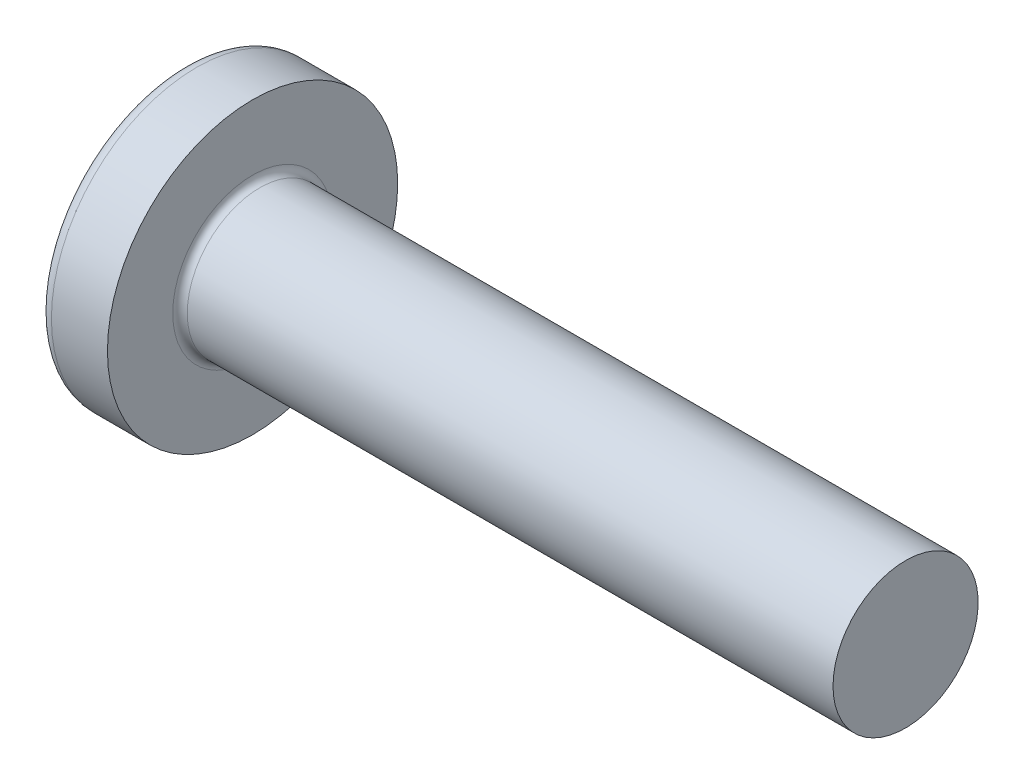
ISO-10303-21;
HEADER;
FILE_DESCRIPTION(('STEP AP214'),'2;1');
FILE_NAME('part.step','',(''),(''),'','','');
FILE_SCHEMA(('AUTOMOTIVE_DESIGN { 1 0 10303 214 1 1 1 1 }'));
ENDSEC;
DATA;
#1=APPLICATION_CONTEXT('core data for automotive mechanical design processes');
#2=APPLICATION_PROTOCOL_DEFINITION('international standard','automotive_design',2000,#1);
#3=PRODUCT_CONTEXT('',#1,'mechanical');
#4=PRODUCT('Part','Part','',(#3));
#5=PRODUCT_RELATED_PRODUCT_CATEGORY('part','',(#4));
#6=PRODUCT_DEFINITION_FORMATION('','',#4);
#7=PRODUCT_DEFINITION_CONTEXT('part definition',#1,'design');
#8=PRODUCT_DEFINITION('design','',#6,#7);
#9=PRODUCT_DEFINITION_SHAPE('','',#8);
#10=(LENGTH_UNIT() NAMED_UNIT(*) SI_UNIT(.MILLI.,.METRE.));
#11=(NAMED_UNIT(*) PLANE_ANGLE_UNIT() SI_UNIT($,.RADIAN.));
#12=(NAMED_UNIT(*) SI_UNIT($,.STERADIAN.) SOLID_ANGLE_UNIT());
#13=UNCERTAINTY_MEASURE_WITH_UNIT(LENGTH_MEASURE(1.E-05),#10,'distance_accuracy_value','');
#14=(GEOMETRIC_REPRESENTATION_CONTEXT(3) GLOBAL_UNCERTAINTY_ASSIGNED_CONTEXT((#13)) GLOBAL_UNIT_ASSIGNED_CONTEXT((#10,
#11,#12)) REPRESENTATION_CONTEXT('',''));
#15=CARTESIAN_POINT('',(0.,0.,0.));
#16=DIRECTION('',(0.,0.,1.));
#17=DIRECTION('',(1.,0.,0.));
#18=AXIS2_PLACEMENT_3D('',#15,#16,#17);
#19=CARTESIAN_POINT('',(6.5,0.,0.));
#20=DIRECTION('',(-1.,0.,0.));
#21=DIRECTION('',(0.,1.,0.));
#22=AXIS2_PLACEMENT_3D('',#19,#20,#21);
#23=SPHERICAL_SURFACE('',#22,6.5);
#24=CARTESIAN_POINT('',(1.26538895452803,0.,0.));
#25=DIRECTION('',(-1.,0.,0.));
#26=DIRECTION('',(0.,0.,1.));
#27=AXIS2_PLACEMENT_3D('',#24,#25,#26);
#28=CIRCLE('',#27,3.85342019543974);
#29=CARTESIAN_POINT('',(1.26538895452803,0.,3.85342019543974));
#30=VERTEX_POINT('',#29);
#31=EDGE_CURVE('E212',#30,#30,#28,.T.);
#32=ORIENTED_EDGE('',*,*,#31,.T.);
#33=EDGE_LOOP('',(#32));
#34=FACE_BOUND('',#33,.T.);
#35=CARTESIAN_POINT('',(0.0788099820016241,0.,0.));
#36=DIRECTION('',(1.,0.,0.));
#37=DIRECTION('',(0.,0.,-1.));
#38=AXIS2_PLACEMENT_3D('',#35,#36,#37);
#39=CIRCLE('',#38,1.0091178091571);
#40=CARTESIAN_POINT('',(0.0788099820016244,-0.514999999999996,-0.867809744562728));
#41=VERTEX_POINT('',#40);
#42=CARTESIAN_POINT('',(0.0788099820016241,-0.867809744562729,-0.515));
#43=VERTEX_POINT('',#42);
#44=EDGE_CURVE('E338',#41,#43,#39,.F.);
#45=ORIENTED_EDGE('',*,*,#44,.F.);
#46=CARTESIAN_POINT('',(6.5,-0.515000000000001,0.));
#47=DIRECTION('',(0.,1.,0.));
#48=DIRECTION('',(0.,0.,1.));
#49=AXIS2_PLACEMENT_3D('',#46,#47,#48);
#50=CIRCLE('',#49,6.47956595768575);
#51=CARTESIAN_POINT('',(0.331830520157854,-0.514999999999992,-1.98455543332603));
#52=VERTEX_POINT('',#51);
#53=EDGE_CURVE('E272',#52,#41,#50,.T.);
#54=ORIENTED_EDGE('',*,*,#53,.F.);
#55=CARTESIAN_POINT('',(6.06443225879603,0.,0.873613881878153));
#56=DIRECTION('',(0.446197753347436,0.,-0.894934391398443));
#57=DIRECTION('',(-0.894934391398442,0.,-0.446197753347436));
#58=AXIS2_PLACEMENT_3D('',#55,#56,#57);
#59=CIRCLE('',#58,6.42628038045433);
#60=CARTESIAN_POINT('',(0.331830520157856,0.515000000000007,-1.98455543332603));
#61=VERTEX_POINT('',#60);
#62=EDGE_CURVE('E246',#52,#61,#59,.T.);
#63=ORIENTED_EDGE('',*,*,#62,.T.);
#64=CARTESIAN_POINT('',(6.5,0.515,0.));
#65=DIRECTION('',(0.,-1.,0.));
#66=DIRECTION('',(0.,0.,-1.));
#67=AXIS2_PLACEMENT_3D('',#64,#65,#66);
#68=CIRCLE('',#67,6.47956595768574);
#69=CARTESIAN_POINT('',(0.0788099820016249,0.515000000000003,-0.867809744562724));
#70=VERTEX_POINT('',#69);
#71=EDGE_CURVE('E300',#70,#61,#68,.T.);
#72=ORIENTED_EDGE('',*,*,#71,.F.);
#73=CARTESIAN_POINT('',(0.0788099820016241,0.867809744562719,-0.515));
#74=VERTEX_POINT('',#73);
#75=EDGE_CURVE('E353',#74,#70,#39,.F.);
#76=ORIENTED_EDGE('',*,*,#75,.F.);
#77=CARTESIAN_POINT('',(6.5,0.,-0.515));
#78=DIRECTION('',(0.,0.,1.));
#79=DIRECTION('',(1.,0.,0.));
#80=AXIS2_PLACEMENT_3D('',#77,#78,#79);
#81=CIRCLE('',#80,6.47956595768574);
#82=CARTESIAN_POINT('',(0.331830520157856,1.98455543332603,-0.515));
#83=VERTEX_POINT('',#82);
#84=EDGE_CURVE('E240',#83,#74,#81,.T.);
#85=ORIENTED_EDGE('',*,*,#84,.F.);
#86=CARTESIAN_POINT('',(6.06443225879604,-0.873613881878154,0.));
#87=DIRECTION('',(0.446197753347436,0.894934391398443,0.));
#88=DIRECTION('',(-0.894934391398442,0.446197753347436,0.));
#89=AXIS2_PLACEMENT_3D('',#86,#87,#88);
#90=CIRCLE('',#89,6.42628038045433);
#91=CARTESIAN_POINT('',(0.331830520157857,1.98455543332603,0.515));
#92=VERTEX_POINT('',#91);
#93=EDGE_CURVE('E243',#83,#92,#90,.T.);
#94=ORIENTED_EDGE('',*,*,#93,.T.);
#95=CARTESIAN_POINT('',(6.5,0.,0.515000000000001));
#96=DIRECTION('',(0.,0.,-1.));
#97=DIRECTION('',(-1.,0.,0.));
#98=AXIS2_PLACEMENT_3D('',#95,#96,#97);
#99=CIRCLE('',#98,6.47956595768574);
#100=CARTESIAN_POINT('',(0.0788099820016241,0.867809744562719,0.514999999999999));
#101=VERTEX_POINT('',#100);
#102=EDGE_CURVE('E236',#101,#92,#99,.T.);
#103=ORIENTED_EDGE('',*,*,#102,.F.);
#104=CARTESIAN_POINT('',(0.0788099820016253,0.514999999999997,0.867809744562727));
#105=VERTEX_POINT('',#104);
#106=EDGE_CURVE('E352',#105,#101,#39,.F.);
#107=ORIENTED_EDGE('',*,*,#106,.F.);
#108=CARTESIAN_POINT('',(0.331830520157856,0.514999999999993,1.98455543332603));
#109=VERTEX_POINT('',#108);
#110=EDGE_CURVE('E256',#109,#105,#68,.T.);
#111=ORIENTED_EDGE('',*,*,#110,.F.);
#112=CARTESIAN_POINT('',(6.06443225879603,0.,-0.873613881878153));
#113=DIRECTION('',(0.446197753347436,0.,0.894934391398443));
#114=DIRECTION('',(0.894934391398442,0.,-0.446197753347436));
#115=AXIS2_PLACEMENT_3D('',#112,#113,#114);
#116=CIRCLE('',#115,6.42628038045433);
#117=CARTESIAN_POINT('',(0.331830520157855,-0.515000000000007,1.98455543332603));
#118=VERTEX_POINT('',#117);
#119=EDGE_CURVE('E47',#109,#118,#116,.T.);
#120=ORIENTED_EDGE('',*,*,#119,.T.);
#121=CARTESIAN_POINT('',(0.0788099820016247,-0.515000000000003,0.867809744562724));
#122=VERTEX_POINT('',#121);
#123=EDGE_CURVE('E253',#122,#118,#50,.T.);
#124=ORIENTED_EDGE('',*,*,#123,.F.);
#125=CARTESIAN_POINT('',(0.0788099820016241,-0.867809744562729,0.514999999999999));
#126=VERTEX_POINT('',#125);
#127=EDGE_CURVE('E384',#126,#122,#39,.F.);
#128=ORIENTED_EDGE('',*,*,#127,.F.);
#129=CARTESIAN_POINT('',(0.331830520157853,-1.98455543332603,0.514999999999999));
#130=VERTEX_POINT('',#129);
#131=EDGE_CURVE('E237',#130,#126,#99,.T.);
#132=ORIENTED_EDGE('',*,*,#131,.F.);
#133=CARTESIAN_POINT('',(6.06443225879603,0.873613881878152,0.));
#134=DIRECTION('',(0.446197753347436,-0.894934391398443,0.));
#135=DIRECTION('',(0.894934391398442,0.446197753347436,0.));
#136=AXIS2_PLACEMENT_3D('',#133,#134,#135);
#137=CIRCLE('',#136,6.42628038045433);
#138=CARTESIAN_POINT('',(0.331830520157853,-1.98455543332603,-0.515));
#139=VERTEX_POINT('',#138);
#140=EDGE_CURVE('E233',#130,#139,#137,.T.);
#141=ORIENTED_EDGE('',*,*,#140,.T.);
#142=EDGE_CURVE('E62',#43,#139,#81,.T.);
#143=ORIENTED_EDGE('',*,*,#142,.F.);
#144=EDGE_LOOP('',(#45,#54,#63,#72,#76,#85,#94,#103,#107,#111,#120,#124,#128,#132,#141,#143));
#145=FACE_BOUND('',#144,.T.);
#146=ADVANCED_FACE('F34',(#34,#145),#23,.T.);
#147=CARTESIAN_POINT('',(0.,2.15,-0.515));
#148=DIRECTION('',(0.,0.,1.));
#149=DIRECTION('',(1.,0.,0.));
#150=AXIS2_PLACEMENT_3D('',#147,#148,#149);
#151=PLANE('',#150);
#152=ORIENTED_EDGE('',*,*,#84,.T.);
#153=CARTESIAN_POINT('',(-1.51195208675156,0.994972220320188,-0.515));
#154=CARTESIAN_POINT('',(-1.20405981949279,0.970722016949958,-0.515));
#155=CARTESIAN_POINT('',(-0.896180907521174,0.946299109919651,-0.515));
#156=CARTESIAN_POINT('',(-0.280449079832185,0.896981122427851,-0.515));
#157=CARTESIAN_POINT('',(0.0274038344396873,0.872086023934883,-0.515));
#158=CARTESIAN_POINT('',(0.489146739515351,0.83429553519528,-0.515));
#159=CARTESIAN_POINT('',(0.643055047553846,0.821624058404092,-0.515));
#160=CARTESIAN_POINT('',(0.950856520197141,0.796108332639504,-0.515));
#161=CARTESIAN_POINT('',(1.10474968487868,0.783264084592465,-0.515));
#162=CARTESIAN_POINT('',(1.41251352095103,0.757376569093378,-0.515));
#163=CARTESIAN_POINT('',(1.56638419296577,0.744333309065218,-0.515));
#164=CARTESIAN_POINT('',(1.87410847343335,0.718013273188896,-0.515));
#165=CARTESIAN_POINT('',(2.02796208151372,0.704736492982792,-0.515));
#166=CARTESIAN_POINT('',(2.36455311890989,0.675386943006726,-0.515));
#167=CARTESIAN_POINT('',(2.54728562293342,0.659257575640986,-0.515));
#168=CARTESIAN_POINT('',(2.91270624109256,0.626517182479888,-0.515));
#169=CARTESIAN_POINT('',(3.09539435554038,0.609906160177238,-0.515));
#170=CARTESIAN_POINT('',(3.46069832191612,0.576073027116421,-0.515));
#171=CARTESIAN_POINT('',(3.64331417870068,0.558850968932727,-0.515));
#172=CARTESIAN_POINT('',(4.00847437496567,0.523604864540037,-0.515));
#173=CARTESIAN_POINT('',(4.19101871216888,0.505580794604253,-0.515));
#174=CARTESIAN_POINT('',(4.55606208157937,0.468429191666488,-0.515));
#175=CARTESIAN_POINT('',(4.73856107358022,0.449301262281854,-0.515));
#176=CARTESIAN_POINT('',(5.10337547353418,0.409473604748924,-0.515));
#177=CARTESIAN_POINT('',(5.28569089526422,0.388774005106069,-0.515));
#178=CARTESIAN_POINT('',(5.55897278495412,0.355828287527264,-0.515));
#179=CARTESIAN_POINT('',(5.65005277419686,0.344527918782738,-0.515));
#180=CARTESIAN_POINT('',(5.83209904103607,0.321075174263031,-0.515));
#181=CARTESIAN_POINT('',(5.92306532397915,0.308922840209686,-0.515));
#182=CARTESIAN_POINT('',(6.10486078872898,0.28342733445193,-0.515));
#183=CARTESIAN_POINT('',(6.19568992299379,0.270083817601714,-0.515));
#184=CARTESIAN_POINT('',(6.33172773785679,0.248701420809951,-0.515));
#185=CARTESIAN_POINT('',(6.37704304473344,0.241345446705304,-0.515));
#186=CARTESIAN_POINT('',(6.4675722520141,0.226018953559337,-0.515));
#187=CARTESIAN_POINT('',(6.51278614568083,0.218048394864476,-0.515));
#188=CARTESIAN_POINT('',(6.55793125759548,0.209691465274944,-0.515));
#189=B_SPLINE_CURVE_WITH_KNOTS('',3,(#153,#154,#155,#156,#157,#158,#159,#160,#161,#162,#163,
#164,#165,#166,#167,#168,#169,#170,#171,#172,#173,#174,#175,#176,#177,#178,#179,#180,#181,#182,
#183,#184,#185,#186,#187,#188),.UNSPECIFIED.,.F.,.F.,(4,2,2,2,2,2,2,2,2,2,2,2,2,2,2,2,2,4),(0.,
0.926537709781721,1.85311087258339,2.31639796016285,2.77968256468771,3.24294992902055,
3.70622594801777,4.25655436065378,4.80687878359543,5.35715597005738,5.90744944680718,
6.45794177197673,7.008389135274,7.28372117336898,7.55903973750591,7.83443833587748,
7.97216007460854,8.10989070671571),.UNSPECIFIED.);
#190=CARTESIAN_POINT('',(2.34,0.677477674908923,-0.515));
#191=VERTEX_POINT('',#190);
#192=EDGE_CURVE('E373',#74,#191,#189,.T.);
#193=ORIENTED_EDGE('',*,*,#192,.T.);
#194=DIRECTION('',(0.,1.,0.));
#195=VECTOR('',#194,1.);
#196=CARTESIAN_POINT('',(2.34,-0.983319232260742,-0.515));
#197=LINE('',#196,#195);
#198=CARTESIAN_POINT('',(2.34,0.983319232260743,-0.515));
#199=VERTEX_POINT('',#198);
#200=EDGE_CURVE('E321',#191,#199,#197,.T.);
#201=ORIENTED_EDGE('',*,*,#200,.T.);
#202=DIRECTION('',(0.894934391398442,-0.446197753347436,0.));
#203=VECTOR('',#202,1.);
#204=CARTESIAN_POINT('',(0.,2.15,-0.515));
#205=LINE('',#204,#203);
#206=EDGE_CURVE('E213',#83,#199,#205,.T.);
#207=ORIENTED_EDGE('',*,*,#206,.F.);
#208=EDGE_LOOP('',(#152,#193,#201,#207));
#209=FACE_BOUND('',#208,.T.);
#210=ADVANCED_FACE('F168',(#209),#151,.T.);
#211=CARTESIAN_POINT('',(2.34,-0.983319232260742,-0.515));
#212=VERTEX_POINT('',#211);
#213=CARTESIAN_POINT('',(2.34,-0.677477674908923,-0.515));
#214=VERTEX_POINT('',#213);
#215=EDGE_CURVE('E221',#212,#214,#197,.T.);
#216=ORIENTED_EDGE('',*,*,#215,.T.);
#217=CARTESIAN_POINT('',(-1.51195208675156,-0.994972220320188,-0.515));
#218=CARTESIAN_POINT('',(-1.20405981949279,-0.970722016949958,-0.515));
#219=CARTESIAN_POINT('',(-0.896180907521174,-0.946299109919651,-0.515));
#220=CARTESIAN_POINT('',(-0.280449079832185,-0.896981122427851,-0.515));
#221=CARTESIAN_POINT('',(0.027403834439687,-0.872086023934883,-0.515));
#222=CARTESIAN_POINT('',(0.48914673951535,-0.83429553519528,-0.515));
#223=CARTESIAN_POINT('',(0.643055047553845,-0.821624058404092,-0.515));
#224=CARTESIAN_POINT('',(0.95085652019714,-0.796108332639504,-0.515));
#225=CARTESIAN_POINT('',(1.10474968487868,-0.783264084592466,-0.515));
#226=CARTESIAN_POINT('',(1.41251352095103,-0.757376569093378,-0.515));
#227=CARTESIAN_POINT('',(1.56638419296577,-0.744333309065218,-0.515));
#228=CARTESIAN_POINT('',(1.87410847343335,-0.718013273188896,-0.515));
#229=CARTESIAN_POINT('',(2.02796208151372,-0.704736492982792,-0.515));
#230=CARTESIAN_POINT('',(2.36455311890989,-0.675386943006726,-0.515));
#231=CARTESIAN_POINT('',(2.54728562293342,-0.659257575640986,-0.515));
#232=CARTESIAN_POINT('',(2.91270624109256,-0.626517182479888,-0.515));
#233=CARTESIAN_POINT('',(3.09539435554038,-0.609906160177238,-0.515));
#234=CARTESIAN_POINT('',(3.46069832191613,-0.576073027116421,-0.515));
#235=CARTESIAN_POINT('',(3.64331417870068,-0.558850968932727,-0.515));
#236=CARTESIAN_POINT('',(4.00847437496567,-0.523604864540037,-0.515));
#237=CARTESIAN_POINT('',(4.19101871216888,-0.505580794604252,-0.515));
#238=CARTESIAN_POINT('',(4.55606208157937,-0.468429191666487,-0.515));
#239=CARTESIAN_POINT('',(4.73856107358023,-0.449301262281853,-0.515));
#240=CARTESIAN_POINT('',(5.10337547353419,-0.409473604748924,-0.515));
#241=CARTESIAN_POINT('',(5.28569089526422,-0.388774005106069,-0.515));
#242=CARTESIAN_POINT('',(5.55897278495412,-0.355828287527264,-0.515));
#243=CARTESIAN_POINT('',(5.65005277419686,-0.344527918782738,-0.515));
#244=CARTESIAN_POINT('',(5.83209904103608,-0.32107517426303,-0.515));
#245=CARTESIAN_POINT('',(5.92306532397915,-0.308922840209685,-0.515));
#246=CARTESIAN_POINT('',(6.10486078872898,-0.283427334451929,-0.515));
#247=CARTESIAN_POINT('',(6.1956899229938,-0.270083817601713,-0.515));
#248=CARTESIAN_POINT('',(6.33172773785679,-0.24870142080995,-0.515));
#249=CARTESIAN_POINT('',(6.37704304473344,-0.241345446705303,-0.515));
#250=CARTESIAN_POINT('',(6.4675722520141,-0.226018953559337,-0.515));
#251=CARTESIAN_POINT('',(6.51278614568083,-0.218048394864475,-0.515));
#252=CARTESIAN_POINT('',(6.55793125759549,-0.209691465274944,-0.515));
#253=B_SPLINE_CURVE_WITH_KNOTS('',3,(#217,#218,#219,#220,#221,#222,#223,#224,#225,#226,#227,
#228,#229,#230,#231,#232,#233,#234,#235,#236,#237,#238,#239,#240,#241,#242,#243,#244,#245,#246,
#247,#248,#249,#250,#251,#252),.UNSPECIFIED.,.F.,.F.,(4,2,2,2,2,2,2,2,2,2,2,2,2,2,2,2,2,4),(0.,
0.926537709781721,1.85311087258339,2.31639796016285,2.77968256468771,3.24294992902054,
3.70622594801777,4.25655436065378,4.80687878359543,5.35715597005738,5.90744944680718,
6.45794177197673,7.008389135274,7.28372117336899,7.55903973750591,7.83443833587749,
7.97216007460855,8.10989070671571),.UNSPECIFIED.);
#254=EDGE_CURVE('E351',#214,#43,#253,.F.);
#255=ORIENTED_EDGE('',*,*,#254,.T.);
#256=ORIENTED_EDGE('',*,*,#142,.T.);
#257=DIRECTION('',(0.894934391398442,0.446197753347436,0.));
#258=VECTOR('',#257,1.);
#259=CARTESIAN_POINT('',(0.,-2.15,-0.515));
#260=LINE('',#259,#258);
#261=EDGE_CURVE('E303',#139,#212,#260,.T.);
#262=ORIENTED_EDGE('',*,*,#261,.T.);
#263=EDGE_LOOP('',(#216,#255,#256,#262));
#264=FACE_BOUND('',#263,.T.);
#265=ADVANCED_FACE('F174',(#264),#151,.T.);
#266=CARTESIAN_POINT('',(0.,-2.15,0.514999999999999));
#267=DIRECTION('',(0.,0.,-1.));
#268=DIRECTION('',(-1.,0.,0.));
#269=AXIS2_PLACEMENT_3D('',#266,#267,#268);
#270=PLANE('',#269);
#271=DIRECTION('',(0.,-1.,0.));
#272=VECTOR('',#271,1.);
#273=CARTESIAN_POINT('',(2.34,0.983319232260742,0.515));
#274=LINE('',#273,#272);
#275=CARTESIAN_POINT('',(2.34,0.983319232260743,0.515));
#276=VERTEX_POINT('',#275);
#277=CARTESIAN_POINT('',(2.34,0.677477674908923,0.515));
#278=VERTEX_POINT('',#277);
#279=EDGE_CURVE('E311',#276,#278,#274,.T.);
#280=ORIENTED_EDGE('',*,*,#279,.T.);
#281=CARTESIAN_POINT('',(-1.51195208675156,0.994972220320188,0.514999999999999));
#282=CARTESIAN_POINT('',(-1.20405981949279,0.970722016949958,0.514999999999999));
#283=CARTESIAN_POINT('',(-0.896180907521173,0.946299109919651,0.514999999999999));
#284=CARTESIAN_POINT('',(-0.280449079832184,0.896981122427852,0.514999999999999));
#285=CARTESIAN_POINT('',(0.0274038344396879,0.872086023934883,0.514999999999999));
#286=CARTESIAN_POINT('',(0.489146739515351,0.83429553519528,0.515));
#287=CARTESIAN_POINT('',(0.643055047553846,0.821624058404092,0.515));
#288=CARTESIAN_POINT('',(0.950856520197141,0.796108332639504,0.515));
#289=CARTESIAN_POINT('',(1.10474968487868,0.783264084592466,0.515));
#290=CARTESIAN_POINT('',(1.41251352095103,0.757376569093379,0.515));
#291=CARTESIAN_POINT('',(1.56638419296577,0.744333309065218,0.515));
#292=CARTESIAN_POINT('',(1.87410847343335,0.718013273188896,0.515));
#293=CARTESIAN_POINT('',(2.02796208151372,0.704736492982792,0.515));
#294=CARTESIAN_POINT('',(2.36455311890989,0.675386943006726,0.515));
#295=CARTESIAN_POINT('',(2.54728562293342,0.659257575640986,0.515));
#296=CARTESIAN_POINT('',(2.91270624109256,0.626517182479888,0.515));
#297=CARTESIAN_POINT('',(3.09539435554038,0.609906160177238,0.515));
#298=CARTESIAN_POINT('',(3.46069832191613,0.576073027116421,0.515));
#299=CARTESIAN_POINT('',(3.64331417870068,0.558850968932727,0.515));
#300=CARTESIAN_POINT('',(4.00847437496567,0.523604864540037,0.515));
#301=CARTESIAN_POINT('',(4.19101871216888,0.505580794604252,0.515));
#302=CARTESIAN_POINT('',(4.55606208157937,0.468429191666487,0.515));
#303=CARTESIAN_POINT('',(4.73856107358023,0.449301262281853,0.515000000000001));
#304=CARTESIAN_POINT('',(5.10337547353419,0.409473604748924,0.515000000000001));
#305=CARTESIAN_POINT('',(5.28569089526422,0.388774005106069,0.515000000000001));
#306=CARTESIAN_POINT('',(5.55897278495412,0.355828287527263,0.515000000000001));
#307=CARTESIAN_POINT('',(5.65005277419686,0.344527918782737,0.515000000000001));
#308=CARTESIAN_POINT('',(5.83209904103608,0.32107517426303,0.515000000000001));
#309=CARTESIAN_POINT('',(5.92306532397915,0.308922840209685,0.515000000000001));
#310=CARTESIAN_POINT('',(6.10486078872898,0.283427334451929,0.515000000000001));
#311=CARTESIAN_POINT('',(6.1956899229938,0.270083817601713,0.515000000000001));
#312=CARTESIAN_POINT('',(6.33172773785679,0.248701420809949,0.515000000000001));
#313=CARTESIAN_POINT('',(6.37704304473344,0.241345446705302,0.515000000000001));
#314=CARTESIAN_POINT('',(6.4675722520141,0.226018953559336,0.515000000000001));
#315=CARTESIAN_POINT('',(6.51278614568083,0.218048394864474,0.515000000000001));
#316=CARTESIAN_POINT('',(6.55793125759549,0.209691465274942,0.515000000000001));
#317=B_SPLINE_CURVE_WITH_KNOTS('',3,(#281,#282,#283,#284,#285,#286,#287,#288,#289,#290,#291,
#292,#293,#294,#295,#296,#297,#298,#299,#300,#301,#302,#303,#304,#305,#306,#307,#308,#309,#310,
#311,#312,#313,#314,#315,#316),.UNSPECIFIED.,.F.,.F.,(4,2,2,2,2,2,2,2,2,2,2,2,2,2,2,2,2,4),(0.,
0.926537709781721,1.85311087258339,2.31639796016285,2.77968256468771,3.24294992902054,
3.70622594801777,4.25655436065378,4.80687878359543,5.35715597005738,5.90744944680718,
6.45794177197673,7.008389135274,7.28372117336899,7.55903973750591,7.83443833587749,
7.97216007460855,8.10989070671571),.UNSPECIFIED.);
#318=EDGE_CURVE('E277',#278,#101,#317,.F.);
#319=ORIENTED_EDGE('',*,*,#318,.T.);
#320=ORIENTED_EDGE('',*,*,#102,.T.);
#321=DIRECTION('',(0.894934391398442,-0.446197753347436,0.));
#322=VECTOR('',#321,1.);
#323=CARTESIAN_POINT('',(0.,2.15,0.515));
#324=LINE('',#323,#322);
#325=EDGE_CURVE('E218',#92,#276,#324,.T.);
#326=ORIENTED_EDGE('',*,*,#325,.T.);
#327=EDGE_LOOP('',(#280,#319,#320,#326));
#328=FACE_BOUND('',#327,.T.);
#329=ADVANCED_FACE('F369',(#328),#270,.T.);
#330=ORIENTED_EDGE('',*,*,#131,.T.);
#331=CARTESIAN_POINT('',(-1.51195208675156,-0.994972220320188,0.514999999999999));
#332=CARTESIAN_POINT('',(-1.20405981949279,-0.970722016949958,0.514999999999999));
#333=CARTESIAN_POINT('',(-0.896180907521174,-0.946299109919651,0.514999999999999));
#334=CARTESIAN_POINT('',(-0.280449079832185,-0.896981122427852,0.514999999999999));
#335=CARTESIAN_POINT('',(0.0274038344396874,-0.872086023934883,0.514999999999999));
#336=CARTESIAN_POINT('',(0.489146739515351,-0.83429553519528,0.514999999999999));
#337=CARTESIAN_POINT('',(0.643055047553846,-0.821624058404092,0.514999999999999));
#338=CARTESIAN_POINT('',(0.950856520197141,-0.796108332639504,0.514999999999999));
#339=CARTESIAN_POINT('',(1.10474968487868,-0.783264084592466,0.515));
#340=CARTESIAN_POINT('',(1.41251352095103,-0.757376569093379,0.515));
#341=CARTESIAN_POINT('',(1.56638419296577,-0.744333309065218,0.515));
#342=CARTESIAN_POINT('',(1.87410847343335,-0.718013273188896,0.515));
#343=CARTESIAN_POINT('',(2.02796208151372,-0.704736492982792,0.515));
#344=CARTESIAN_POINT('',(2.36455311890989,-0.675386943006726,0.515));
#345=CARTESIAN_POINT('',(2.54728562293342,-0.659257575640986,0.515));
#346=CARTESIAN_POINT('',(2.91270624109256,-0.626517182479888,0.515));
#347=CARTESIAN_POINT('',(3.09539435554038,-0.609906160177238,0.515));
#348=CARTESIAN_POINT('',(3.46069832191613,-0.576073027116421,0.515));
#349=CARTESIAN_POINT('',(3.64331417870068,-0.558850968932727,0.515));
#350=CARTESIAN_POINT('',(4.00847437496567,-0.523604864540037,0.515));
#351=CARTESIAN_POINT('',(4.19101871216888,-0.505580794604253,0.515));
#352=CARTESIAN_POINT('',(4.55606208157937,-0.468429191666487,0.515));
#353=CARTESIAN_POINT('',(4.73856107358022,-0.449301262281853,0.515));
#354=CARTESIAN_POINT('',(5.10337547353418,-0.409473604748924,0.515));
#355=CARTESIAN_POINT('',(5.28569089526422,-0.388774005106069,0.515));
#356=CARTESIAN_POINT('',(5.55897278495412,-0.355828287527263,0.515000000000001));
#357=CARTESIAN_POINT('',(5.65005277419686,-0.344527918782738,0.515000000000001));
#358=CARTESIAN_POINT('',(5.83209904103607,-0.32107517426303,0.515000000000001));
#359=CARTESIAN_POINT('',(5.92306532397915,-0.308922840209685,0.515000000000001));
#360=CARTESIAN_POINT('',(6.10486078872898,-0.283427334451929,0.515000000000001));
#361=CARTESIAN_POINT('',(6.19568992299379,-0.270083817601713,0.515000000000001));
#362=CARTESIAN_POINT('',(6.33172773785679,-0.24870142080995,0.515000000000001));
#363=CARTESIAN_POINT('',(6.37704304473344,-0.241345446705303,0.515000000000001));
#364=CARTESIAN_POINT('',(6.4675722520141,-0.226018953559336,0.515000000000001));
#365=CARTESIAN_POINT('',(6.51278614568083,-0.218048394864474,0.515000000000001));
#366=CARTESIAN_POINT('',(6.55793125759549,-0.209691465274943,0.515000000000001));
#367=B_SPLINE_CURVE_WITH_KNOTS('',3,(#331,#332,#333,#334,#335,#336,#337,#338,#339,#340,#341,
#342,#343,#344,#345,#346,#347,#348,#349,#350,#351,#352,#353,#354,#355,#356,#357,#358,#359,#360,
#361,#362,#363,#364,#365,#366),.UNSPECIFIED.,.F.,.F.,(4,2,2,2,2,2,2,2,2,2,2,2,2,2,2,2,2,4),(0.,
0.926537709781721,1.85311087258339,2.31639796016285,2.77968256468771,3.24294992902055,
3.70622594801777,4.25655436065378,4.80687878359543,5.35715597005738,5.90744944680718,
6.45794177197673,7.008389135274,7.28372117336899,7.55903973750591,7.83443833587748,
7.97216007460854,8.10989070671571),.UNSPECIFIED.);
#368=CARTESIAN_POINT('',(2.34,-0.677477674908923,0.515));
#369=VERTEX_POINT('',#368);
#370=EDGE_CURVE('E385',#126,#369,#367,.T.);
#371=ORIENTED_EDGE('',*,*,#370,.T.);
#372=CARTESIAN_POINT('',(2.34,-0.983319232260743,0.515));
#373=VERTEX_POINT('',#372);
#374=EDGE_CURVE('E313',#369,#373,#274,.T.);
#375=ORIENTED_EDGE('',*,*,#374,.T.);
#376=DIRECTION('',(0.894934391398443,0.446197753347436,0.));
#377=VECTOR('',#376,1.);
#378=CARTESIAN_POINT('',(0.,-2.15,0.514999999999999));
#379=LINE('',#378,#377);
#380=EDGE_CURVE('E305',#130,#373,#379,.T.);
#381=ORIENTED_EDGE('',*,*,#380,.F.);
#382=EDGE_LOOP('',(#330,#371,#375,#381));
#383=FACE_BOUND('',#382,.T.);
#384=ADVANCED_FACE('F412',(#383),#270,.T.);
#385=CARTESIAN_POINT('',(2.34,0.983319232260742,-0.515));
#386=DIRECTION('',(-1.,0.,0.));
#387=DIRECTION('',(0.,0.,1.));
#388=AXIS2_PLACEMENT_3D('',#385,#386,#387);
#389=PLANE('',#388);
#390=ORIENTED_EDGE('',*,*,#374,.F.);
#391=CARTESIAN_POINT('',(2.34,0.,0.));
#392=DIRECTION('',(-1.,0.,0.));
#393=DIRECTION('',(0.,0.,1.));
#394=AXIS2_PLACEMENT_3D('',#391,#392,#393);
#395=CIRCLE('',#394,0.851);
#396=EDGE_CURVE('E346',#214,#369,#395,.T.);
#397=ORIENTED_EDGE('',*,*,#396,.F.);
#398=ORIENTED_EDGE('',*,*,#215,.F.);
#399=DIRECTION('',(0.,0.,1.));
#400=VECTOR('',#399,1.);
#401=CARTESIAN_POINT('',(2.34,-0.983319232260742,-0.515));
#402=LINE('',#401,#400);
#403=EDGE_CURVE('E308',#212,#373,#402,.T.);
#404=ORIENTED_EDGE('',*,*,#403,.T.);
#405=EDGE_LOOP('',(#390,#397,#398,#404));
#406=FACE_BOUND('',#405,.T.);
#407=ADVANCED_FACE('F410',(#406),#389,.T.);
#408=DIRECTION('',(0.,0.,-1.));
#409=VECTOR('',#408,1.);
#410=CARTESIAN_POINT('',(2.34,-0.515000000000004,0.983319232260741));
#411=LINE('',#410,#409);
#412=CARTESIAN_POINT('',(2.34,-0.514999999999997,-0.677477674908925));
#413=VERTEX_POINT('',#412);
#414=CARTESIAN_POINT('',(2.34,-0.514999999999996,-0.983319232260744));
#415=VERTEX_POINT('',#414);
#416=EDGE_CURVE('E294',#413,#415,#411,.T.);
#417=ORIENTED_EDGE('',*,*,#416,.F.);
#418=CARTESIAN_POINT('',(2.34,0.515000000000003,-0.677477674908921));
#419=VERTEX_POINT('',#418);
#420=EDGE_CURVE('E54',#419,#413,#395,.T.);
#421=ORIENTED_EDGE('',*,*,#420,.F.);
#422=DIRECTION('',(0.,0.,1.));
#423=VECTOR('',#422,1.);
#424=CARTESIAN_POINT('',(2.34,0.515000000000004,-0.983319232260741));
#425=LINE('',#424,#423);
#426=CARTESIAN_POINT('',(2.34,0.515000000000004,-0.983319232260741));
#427=VERTEX_POINT('',#426);
#428=EDGE_CURVE('E297',#427,#419,#425,.T.);
#429=ORIENTED_EDGE('',*,*,#428,.F.);
#430=DIRECTION('',(0.,-1.,0.));
#431=VECTOR('',#430,1.);
#432=CARTESIAN_POINT('',(2.34,0.515000000000004,-0.983319232260741));
#433=LINE('',#432,#431);
#434=EDGE_CURVE('E288',#427,#415,#433,.T.);
#435=ORIENTED_EDGE('',*,*,#434,.T.);
#436=EDGE_LOOP('',(#417,#421,#429,#435));
#437=FACE_BOUND('',#436,.T.);
#438=ADVANCED_FACE('F341',(#437),#389,.T.);
#439=ORIENTED_EDGE('',*,*,#200,.F.);
#440=EDGE_CURVE('E345',#278,#191,#395,.T.);
#441=ORIENTED_EDGE('',*,*,#440,.F.);
#442=ORIENTED_EDGE('',*,*,#279,.F.);
#443=DIRECTION('',(0.,0.,-1.));
#444=VECTOR('',#443,1.);
#445=CARTESIAN_POINT('',(2.34,0.983319232260742,0.515));
#446=LINE('',#445,#444);
#447=EDGE_CURVE('E314',#276,#199,#446,.T.);
#448=ORIENTED_EDGE('',*,*,#447,.T.);
#449=EDGE_LOOP('',(#439,#441,#442,#448));
#450=FACE_BOUND('',#449,.T.);
#451=ADVANCED_FACE('F419',(#450),#389,.T.);
#452=CARTESIAN_POINT('',(2.34,0.514999999999998,0.677477674908924));
#453=VERTEX_POINT('',#452);
#454=CARTESIAN_POINT('',(2.34,0.514999999999997,0.983319232260744));
#455=VERTEX_POINT('',#454);
#456=EDGE_CURVE('E270',#453,#455,#425,.T.);
#457=ORIENTED_EDGE('',*,*,#456,.F.);
#458=CARTESIAN_POINT('',(2.34,-0.515000000000003,0.677477674908921));
#459=VERTEX_POINT('',#458);
#460=EDGE_CURVE('E349',#459,#453,#395,.T.);
#461=ORIENTED_EDGE('',*,*,#460,.F.);
#462=CARTESIAN_POINT('',(2.34,-0.515000000000004,0.983319232260741));
#463=VERTEX_POINT('',#462);
#464=EDGE_CURVE('E291',#463,#459,#411,.T.);
#465=ORIENTED_EDGE('',*,*,#464,.F.);
#466=DIRECTION('',(0.,1.,0.));
#467=VECTOR('',#466,1.);
#468=CARTESIAN_POINT('',(2.34,-0.515000000000004,0.983319232260741));
#469=LINE('',#468,#467);
#470=EDGE_CURVE('E295',#463,#455,#469,.T.);
#471=ORIENTED_EDGE('',*,*,#470,.T.);
#472=EDGE_LOOP('',(#457,#461,#465,#471));
#473=FACE_BOUND('',#472,.T.);
#474=ADVANCED_FACE('F414',(#473),#389,.T.);
#475=CARTESIAN_POINT('',(0.,0.514999999999993,2.15));
#476=DIRECTION('',(0.,-1.,0.));
#477=DIRECTION('',(1.,0.,0.));
#478=AXIS2_PLACEMENT_3D('',#475,#476,#477);
#479=PLANE('',#478);
#480=ORIENTED_EDGE('',*,*,#110,.T.);
#481=CARTESIAN_POINT('',(-1.51195208675156,0.514999999999997,0.994972220320189));
#482=CARTESIAN_POINT('',(-1.20405981949279,0.514999999999997,0.97072201694996));
#483=CARTESIAN_POINT('',(-0.896180907521173,0.514999999999997,0.946299109919652));
#484=CARTESIAN_POINT('',(-0.280449079832184,0.514999999999997,0.896981122427853));
#485=CARTESIAN_POINT('',(0.0274038344396879,0.514999999999997,0.872086023934884));
#486=CARTESIAN_POINT('',(0.489146739515351,0.514999999999997,0.834295535195282));
#487=CARTESIAN_POINT('',(0.643055047553846,0.514999999999997,0.821624058404094));
#488=CARTESIAN_POINT('',(0.950856520197141,0.514999999999997,0.796108332639506));
#489=CARTESIAN_POINT('',(1.10474968487868,0.514999999999997,0.783264084592467));
#490=CARTESIAN_POINT('',(1.41251352095103,0.514999999999997,0.75737656909338));
#491=CARTESIAN_POINT('',(1.56638419296577,0.514999999999997,0.74433330906522));
#492=CARTESIAN_POINT('',(1.87410847343335,0.514999999999998,0.718013273188897));
#493=CARTESIAN_POINT('',(2.02796208151372,0.514999999999998,0.704736492982794));
#494=CARTESIAN_POINT('',(2.36455311890989,0.514999999999998,0.675386943006728));
#495=CARTESIAN_POINT('',(2.54728562293342,0.514999999999998,0.659257575640987));
#496=CARTESIAN_POINT('',(2.91270624109256,0.514999999999998,0.626517182479889));
#497=CARTESIAN_POINT('',(3.09539435554038,0.514999999999998,0.60990616017724));
#498=CARTESIAN_POINT('',(3.46069832191613,0.514999999999998,0.576073027116423));
#499=CARTESIAN_POINT('',(3.64331417870068,0.514999999999998,0.558850968932729));
#500=CARTESIAN_POINT('',(4.00847437496567,0.514999999999998,0.523604864540039));
#501=CARTESIAN_POINT('',(4.19101871216888,0.514999999999998,0.505580794604254));
#502=CARTESIAN_POINT('',(4.55606208157937,0.514999999999999,0.468429191666489));
#503=CARTESIAN_POINT('',(4.73856107358023,0.514999999999999,0.449301262281855));
#504=CARTESIAN_POINT('',(5.10337547353419,0.514999999999999,0.409473604748926));
#505=CARTESIAN_POINT('',(5.28569089526422,0.514999999999999,0.388774005106071));
#506=CARTESIAN_POINT('',(5.55897278495412,0.514999999999999,0.355828287527265));
#507=CARTESIAN_POINT('',(5.65005277419686,0.514999999999999,0.344527918782739));
#508=CARTESIAN_POINT('',(5.83209904103608,0.514999999999999,0.321075174263032));
#509=CARTESIAN_POINT('',(5.92306532397915,0.514999999999999,0.308922840209687));
#510=CARTESIAN_POINT('',(6.10486078872898,0.514999999999999,0.283427334451931));
#511=CARTESIAN_POINT('',(6.19568992299379,0.514999999999999,0.270083817601715));
#512=CARTESIAN_POINT('',(6.33172773785679,0.514999999999999,0.248701420809952));
#513=CARTESIAN_POINT('',(6.37704304473344,0.514999999999999,0.241345446705305));
#514=CARTESIAN_POINT('',(6.4675722520141,0.514999999999999,0.226018953559339));
#515=CARTESIAN_POINT('',(6.51278614568083,0.514999999999999,0.218048394864478));
#516=CARTESIAN_POINT('',(6.55793125759549,0.515,0.209691465274946));
#517=B_SPLINE_CURVE_WITH_KNOTS('',3,(#481,#482,#483,#484,#485,#486,#487,#488,#489,#490,#491,
#492,#493,#494,#495,#496,#497,#498,#499,#500,#501,#502,#503,#504,#505,#506,#507,#508,#509,#510,
#511,#512,#513,#514,#515,#516),.UNSPECIFIED.,.F.,.F.,(4,2,2,2,2,2,2,2,2,2,2,2,2,2,2,2,2,4),(0.,
0.926537709781721,1.85311087258339,2.31639796016285,2.77968256468771,3.24294992902054,
3.70622594801777,4.25655436065378,4.80687878359543,5.35715597005738,5.90744944680718,
6.45794177197673,7.008389135274,7.28372117336899,7.55903973750591,7.83443833587748,
7.97216007460854,8.10989070671571),.UNSPECIFIED.);
#518=EDGE_CURVE('E433',#105,#453,#517,.T.);
#519=ORIENTED_EDGE('',*,*,#518,.T.);
#520=ORIENTED_EDGE('',*,*,#456,.T.);
#521=DIRECTION('',(0.894934391398442,0.,-0.446197753347436));
#522=VECTOR('',#521,1.);
#523=CARTESIAN_POINT('',(0.,0.514999999999993,2.15));
#524=LINE('',#523,#522);
#525=EDGE_CURVE('E263',#109,#455,#524,.T.);
#526=ORIENTED_EDGE('',*,*,#525,.F.);
#527=EDGE_LOOP('',(#480,#519,#520,#526));
#528=FACE_BOUND('',#527,.T.);
#529=ADVANCED_FACE('F267',(#528),#479,.T.);
#530=CARTESIAN_POINT('',(0.,-0.514999999999992,-2.15));
#531=DIRECTION('',(0.,1.,0.));
#532=DIRECTION('',(-1.,0.,0.));
#533=AXIS2_PLACEMENT_3D('',#530,#531,#532);
#534=PLANE('',#533);
#535=ORIENTED_EDGE('',*,*,#464,.T.);
#536=CARTESIAN_POINT('',(-1.51195208754037,-0.515000000000003,0.994972220382296));
#537=CARTESIAN_POINT('',(-1.20405982018868,-0.515000000000003,0.970722017005062));
#538=CARTESIAN_POINT('',(-0.896180908124144,-0.515000000000003,0.946299109967687));
#539=CARTESIAN_POINT('',(-0.280449080249313,-0.515000000000003,0.896981122461526));
#540=CARTESIAN_POINT('',(0.027403834115485,-0.515000000000003,0.872086023961263));
#541=CARTESIAN_POINT('',(0.489146739371409,-0.515000000000003,0.834295535207135));
#542=CARTESIAN_POINT('',(0.643055047497245,-0.515000000000003,0.821624058408794));
#543=CARTESIAN_POINT('',(0.950856520315204,-0.515000000000003,0.796108332629704));
#544=CARTESIAN_POINT('',(1.10474968508407,-0.515000000000003,0.783264084575316));
#545=CARTESIAN_POINT('',(1.41251352133103,-0.515000000000003,0.757376569061286));
#546=CARTESIAN_POINT('',(1.56638419343305,-0.515000000000003,0.744333309025532));
#547=CARTESIAN_POINT('',(1.87410847407519,-0.515000000000003,0.718013273133714));
#548=CARTESIAN_POINT('',(2.02796208224283,-0.515000000000002,0.704736492919708));
#549=CARTESIAN_POINT('',(2.36455311972626,-0.515000000000002,0.675386942934954));
#550=CARTESIAN_POINT('',(2.5472856237498,-0.515000000000002,0.659257575568566));
#551=CARTESIAN_POINT('',(2.91270624190895,-0.515000000000002,0.626517182406012));
#552=CARTESIAN_POINT('',(3.09539435635676,-0.515000000000002,0.609906160102553));
#553=CARTESIAN_POINT('',(3.46069832273244,-0.515000000000002,0.576073027039887));
#554=CARTESIAN_POINT('',(3.64331417951694,-0.515000000000002,0.558850968855155));
#555=CARTESIAN_POINT('',(4.00847437578178,-0.515000000000002,0.523604864460042));
#556=CARTESIAN_POINT('',(4.1910187129849,-0.515000000000002,0.505580794522874));
#557=CARTESIAN_POINT('',(4.55606208239526,-0.515000000000002,0.468429191581778));
#558=CARTESIAN_POINT('',(4.73856107439606,-0.515000000000002,0.449301262195196));
#559=CARTESIAN_POINT('',(5.10337547434977,-0.515000000000002,0.409473604657433));
#560=CARTESIAN_POINT('',(5.28569089607961,-0.515000000000002,0.388774005011692));
#561=CARTESIAN_POINT('',(5.55897278576906,-0.515000000000002,0.35582828742708));
#562=CARTESIAN_POINT('',(5.65005277501166,-0.515000000000002,0.344527918680366));
#563=CARTESIAN_POINT('',(5.83209904185046,-0.515000000000002,0.321075174155497));
#564=CARTESIAN_POINT('',(5.92306532479326,-0.515000000000002,0.308922840099178));
#565=CARTESIAN_POINT('',(6.10486078954238,-0.515000000000002,0.28342733433415));
#566=CARTESIAN_POINT('',(6.19568992380676,-0.515000000000002,0.270083817479634));
#567=CARTESIAN_POINT('',(6.33172773866873,-0.515000000000002,0.248701420679476));
#568=CARTESIAN_POINT('',(6.37704304554499,-0.515000000000002,0.241345446571704));
#569=CARTESIAN_POINT('',(6.46757225282465,-0.515000000000002,0.22601895341842));
#570=CARTESIAN_POINT('',(6.51278614649077,-0.515000000000002,0.218048394719365));
#571=CARTESIAN_POINT('',(6.55793125840465,-0.515000000000002,0.209691465124898));
#572=B_SPLINE_CURVE_WITH_KNOTS('',3,(#536,#537,#538,#539,#540,#541,#542,#543,#544,#545,#546,
#547,#548,#549,#550,#551,#552,#553,#554,#555,#556,#557,#558,#559,#560,#561,#562,#563,#564,#565,
#566,#567,#568,#569,#570,#571),.UNSPECIFIED.,.F.,.F.,(4,2,2,2,2,2,2,2,2,2,2,2,2,2,2,2,2,4),(0.,
0.926537710061278,1.85311087314258,2.31639796098494,2.77968256577269,3.24294993036838,
3.70622594962848,4.25655436226469,4.80687878520654,5.3571559716686,5.90744944841854,
6.45794177358856,7.00838913688618,7.28372117498157,7.55903973911884,7.83443833749096,
7.97216007622236,8.10989070832989),.UNSPECIFIED.);
#573=EDGE_CURVE('E378',#459,#122,#572,.F.);
#574=ORIENTED_EDGE('',*,*,#573,.T.);
#575=ORIENTED_EDGE('',*,*,#123,.T.);
#576=DIRECTION('',(0.894934391398442,0.,-0.446197753347436));
#577=VECTOR('',#576,1.);
#578=CARTESIAN_POINT('',(0.,-0.515000000000007,2.15));
#579=LINE('',#578,#577);
#580=EDGE_CURVE('E265',#118,#463,#579,.T.);
#581=ORIENTED_EDGE('',*,*,#580,.T.);
#582=EDGE_LOOP('',(#535,#574,#575,#581));
#583=FACE_BOUND('',#582,.T.);
#584=ADVANCED_FACE('F203',(#583),#534,.T.);
#585=ORIENTED_EDGE('',*,*,#428,.T.);
#586=CARTESIAN_POINT('',(-1.51195208754037,0.515000000000004,-0.994972220382296));
#587=CARTESIAN_POINT('',(-1.20405982018868,0.515000000000003,-0.970722017005062));
#588=CARTESIAN_POINT('',(-0.896180908124144,0.515000000000003,-0.946299109967687));
#589=CARTESIAN_POINT('',(-0.280449080249312,0.515000000000003,-0.896981122461525));
#590=CARTESIAN_POINT('',(0.0274038341154851,0.515000000000003,-0.872086023961263));
#591=CARTESIAN_POINT('',(0.489146739371408,0.515000000000003,-0.834295535207134));
#592=CARTESIAN_POINT('',(0.643055047497245,0.515000000000003,-0.821624058408794));
#593=CARTESIAN_POINT('',(0.950856520315203,0.515000000000003,-0.796108332629704));
#594=CARTESIAN_POINT('',(1.10474968508407,0.515000000000003,-0.783264084575316));
#595=CARTESIAN_POINT('',(1.41251352133103,0.515000000000003,-0.757376569061286));
#596=CARTESIAN_POINT('',(1.56638419343305,0.515000000000003,-0.744333309025532));
#597=CARTESIAN_POINT('',(1.87410847407519,0.515000000000003,-0.718013273133714));
#598=CARTESIAN_POINT('',(2.02796208224283,0.515000000000003,-0.704736492919708));
#599=CARTESIAN_POINT('',(2.36455311972626,0.515000000000002,-0.675386942934954));
#600=CARTESIAN_POINT('',(2.5472856237498,0.515000000000002,-0.659257575568566));
#601=CARTESIAN_POINT('',(2.91270624190895,0.515000000000002,-0.626517182406012));
#602=CARTESIAN_POINT('',(3.09539435635676,0.515000000000002,-0.609906160102552));
#603=CARTESIAN_POINT('',(3.46069832273244,0.515000000000002,-0.576073027039887));
#604=CARTESIAN_POINT('',(3.64331417951694,0.515000000000002,-0.558850968855155));
#605=CARTESIAN_POINT('',(4.00847437578178,0.515000000000002,-0.523604864460042));
#606=CARTESIAN_POINT('',(4.1910187129849,0.515000000000002,-0.505580794522874));
#607=CARTESIAN_POINT('',(4.55606208239526,0.515000000000002,-0.468429191581778));
#608=CARTESIAN_POINT('',(4.73856107439606,0.515000000000002,-0.449301262195196));
#609=CARTESIAN_POINT('',(5.10337547434977,0.515000000000002,-0.409473604657433));
#610=CARTESIAN_POINT('',(5.28569089607961,0.515000000000002,-0.388774005011693));
#611=CARTESIAN_POINT('',(5.55897278576906,0.515000000000002,-0.35582828742708));
#612=CARTESIAN_POINT('',(5.65005277501166,0.515000000000001,-0.344527918680367));
#613=CARTESIAN_POINT('',(5.83209904185046,0.515000000000001,-0.321075174155498));
#614=CARTESIAN_POINT('',(5.92306532479326,0.515000000000001,-0.308922840099179));
#615=CARTESIAN_POINT('',(6.10486078954238,0.515000000000001,-0.283427334334151));
#616=CARTESIAN_POINT('',(6.19568992380675,0.515000000000001,-0.270083817479635));
#617=CARTESIAN_POINT('',(6.33172773866873,0.515000000000001,-0.248701420679477));
#618=CARTESIAN_POINT('',(6.37704304554499,0.515000000000001,-0.241345446571705));
#619=CARTESIAN_POINT('',(6.46757225282465,0.515000000000001,-0.226018953418421));
#620=CARTESIAN_POINT('',(6.51278614649077,0.515000000000001,-0.218048394719367));
#621=CARTESIAN_POINT('',(6.55793125840465,0.515000000000001,-0.209691465124899));
#622=B_SPLINE_CURVE_WITH_KNOTS('',3,(#586,#587,#588,#589,#590,#591,#592,#593,#594,#595,#596,
#597,#598,#599,#600,#601,#602,#603,#604,#605,#606,#607,#608,#609,#610,#611,#612,#613,#614,#615,
#616,#617,#618,#619,#620,#621),.UNSPECIFIED.,.F.,.F.,(4,2,2,2,2,2,2,2,2,2,2,2,2,2,2,2,2,4),(0.,
0.926537710061278,1.85311087314258,2.31639796098494,2.77968256577269,3.24294993036838,
3.70622594962848,4.25655436226469,4.80687878520654,5.3571559716686,5.90744944841855,
6.45794177358856,7.00838913688618,7.28372117498156,7.55903973911884,7.83443833749096,
7.97216007622236,8.10989070832989),.UNSPECIFIED.);
#623=EDGE_CURVE('E330',#419,#70,#622,.F.);
#624=ORIENTED_EDGE('',*,*,#623,.T.);
#625=ORIENTED_EDGE('',*,*,#71,.T.);
#626=DIRECTION('',(0.894934391398442,0.,0.446197753347436));
#627=VECTOR('',#626,1.);
#628=CARTESIAN_POINT('',(0.,0.515000000000008,-2.15));
#629=LINE('',#628,#627);
#630=EDGE_CURVE('E274',#61,#427,#629,.T.);
#631=ORIENTED_EDGE('',*,*,#630,.T.);
#632=EDGE_LOOP('',(#585,#624,#625,#631));
#633=FACE_BOUND('',#632,.T.);
#634=ADVANCED_FACE('F201',(#633),#479,.T.);
#635=ORIENTED_EDGE('',*,*,#53,.T.);
#636=CARTESIAN_POINT('',(-1.51195208675156,-0.514999999999996,-0.99497222032019));
#637=CARTESIAN_POINT('',(-1.20405981949279,-0.514999999999996,-0.97072201694996));
#638=CARTESIAN_POINT('',(-0.896180907521174,-0.514999999999996,-0.946299109919653));
#639=CARTESIAN_POINT('',(-0.280449079832186,-0.514999999999996,-0.896981122427854));
#640=CARTESIAN_POINT('',(0.0274038344396869,-0.514999999999996,-0.872086023934885));
#641=CARTESIAN_POINT('',(0.48914673951535,-0.514999999999997,-0.834295535195282));
#642=CARTESIAN_POINT('',(0.643055047553845,-0.514999999999997,-0.821624058404094));
#643=CARTESIAN_POINT('',(0.95085652019714,-0.514999999999997,-0.796108332639506));
#644=CARTESIAN_POINT('',(1.10474968487868,-0.514999999999997,-0.783264084592468));
#645=CARTESIAN_POINT('',(1.41251352095103,-0.514999999999997,-0.757376569093381));
#646=CARTESIAN_POINT('',(1.56638419296577,-0.514999999999997,-0.74433330906522));
#647=CARTESIAN_POINT('',(1.87410847343335,-0.514999999999997,-0.718013273188898));
#648=CARTESIAN_POINT('',(2.02796208151372,-0.514999999999997,-0.704736492982794));
#649=CARTESIAN_POINT('',(2.36455311890989,-0.514999999999998,-0.675386943006728));
#650=CARTESIAN_POINT('',(2.54728562293342,-0.514999999999998,-0.659257575640988));
#651=CARTESIAN_POINT('',(2.91270624109256,-0.514999999999998,-0.62651718247989));
#652=CARTESIAN_POINT('',(3.09539435554038,-0.514999999999998,-0.60990616017724));
#653=CARTESIAN_POINT('',(3.46069832191612,-0.514999999999998,-0.576073027116423));
#654=CARTESIAN_POINT('',(3.64331417870068,-0.514999999999998,-0.558850968932729));
#655=CARTESIAN_POINT('',(4.00847437496567,-0.514999999999998,-0.523604864540039));
#656=CARTESIAN_POINT('',(4.19101871216888,-0.514999999999999,-0.505580794604254));
#657=CARTESIAN_POINT('',(4.55606208157937,-0.514999999999999,-0.468429191666489));
#658=CARTESIAN_POINT('',(4.73856107358022,-0.514999999999999,-0.449301262281855));
#659=CARTESIAN_POINT('',(5.10337547353418,-0.514999999999999,-0.409473604748926));
#660=CARTESIAN_POINT('',(5.28569089526422,-0.514999999999999,-0.388774005106071));
#661=CARTESIAN_POINT('',(5.55897278495412,-0.514999999999999,-0.355828287527265));
#662=CARTESIAN_POINT('',(5.65005277419686,-0.514999999999999,-0.34452791878274));
#663=CARTESIAN_POINT('',(5.83209904103607,-0.515,-0.321075174263032));
#664=CARTESIAN_POINT('',(5.92306532397915,-0.515,-0.308922840209687));
#665=CARTESIAN_POINT('',(6.10486078872898,-0.515,-0.283427334451931));
#666=CARTESIAN_POINT('',(6.19568992299379,-0.515,-0.270083817601715));
#667=CARTESIAN_POINT('',(6.33172773785679,-0.515,-0.248701420809951));
#668=CARTESIAN_POINT('',(6.37704304473344,-0.515,-0.241345446705304));
#669=CARTESIAN_POINT('',(6.4675722520141,-0.515,-0.226018953559338));
#670=CARTESIAN_POINT('',(6.51278614568083,-0.515,-0.218048394864476));
#671=CARTESIAN_POINT('',(6.55793125759548,-0.515,-0.209691465274945));
#672=B_SPLINE_CURVE_WITH_KNOTS('',3,(#636,#637,#638,#639,#640,#641,#642,#643,#644,#645,#646,
#647,#648,#649,#650,#651,#652,#653,#654,#655,#656,#657,#658,#659,#660,#661,#662,#663,#664,#665,
#666,#667,#668,#669,#670,#671),.UNSPECIFIED.,.F.,.F.,(4,2,2,2,2,2,2,2,2,2,2,2,2,2,2,2,2,4),(0.,
0.926537709781721,1.85311087258339,2.31639796016285,2.77968256468771,3.24294992902054,
3.70622594801777,4.25655436065378,4.80687878359543,5.35715597005738,5.90744944680718,
6.45794177197673,7.008389135274,7.28372117336899,7.55903973750591,7.83443833587749,
7.97216007460855,8.10989070671571),.UNSPECIFIED.);
#673=EDGE_CURVE('E11',#41,#413,#672,.T.);
#674=ORIENTED_EDGE('',*,*,#673,.T.);
#675=ORIENTED_EDGE('',*,*,#416,.T.);
#676=DIRECTION('',(0.894934391398443,0.,0.446197753347436));
#677=VECTOR('',#676,1.);
#678=CARTESIAN_POINT('',(0.,-0.514999999999992,-2.15));
#679=LINE('',#678,#677);
#680=EDGE_CURVE('E285',#52,#415,#679,.T.);
#681=ORIENTED_EDGE('',*,*,#680,.F.);
#682=EDGE_LOOP('',(#635,#674,#675,#681));
#683=FACE_BOUND('',#682,.T.);
#684=ADVANCED_FACE('F196',(#683),#534,.T.);
#685=CARTESIAN_POINT('',(-25.4,0.,0.));
#686=DIRECTION('',(-1.,0.,0.));
#687=DIRECTION('',(0.,0.,1.));
#688=AXIS2_PLACEMENT_3D('',#685,#686,#687);
#689=CYLINDRICAL_SURFACE('',#688,2.);
#690=CARTESIAN_POINT('',(3.3,0.,0.));
#691=DIRECTION('',(-1.,0.,0.));
#692=DIRECTION('',(0.,0.,1.));
#693=AXIS2_PLACEMENT_3D('',#690,#691,#692);
#694=CIRCLE('',#693,2.);
#695=CARTESIAN_POINT('',(3.3,0.,2.));
#696=VERTEX_POINT('',#695);
#697=EDGE_CURVE('E207',#696,#696,#694,.F.);
#698=ORIENTED_EDGE('',*,*,#697,.T.);
#699=EDGE_LOOP('',(#698));
#700=FACE_BOUND('',#699,.T.);
#701=CARTESIAN_POINT('',(21.1,0.,0.));
#702=DIRECTION('',(-1.,0.,0.));
#703=DIRECTION('',(0.,0.,1.));
#704=AXIS2_PLACEMENT_3D('',#701,#702,#703);
#705=CIRCLE('',#704,2.);
#706=CARTESIAN_POINT('',(21.1,0.,2.));
#707=VERTEX_POINT('',#706);
#708=EDGE_CURVE('E210',#707,#707,#705,.T.);
#709=ORIENTED_EDGE('',*,*,#708,.T.);
#710=EDGE_LOOP('',(#709));
#711=FACE_BOUND('',#710,.T.);
#712=ADVANCED_FACE('F193',(#700,#711),#689,.T.);
#713=CARTESIAN_POINT('',(3.1,2.,0.));
#714=DIRECTION('',(-1.,0.,0.));
#715=DIRECTION('',(0.,0.,1.));
#716=AXIS2_PLACEMENT_3D('',#713,#714,#715);
#717=PLANE('',#716);
#718=CARTESIAN_POINT('',(3.1,0.,0.));
#719=DIRECTION('',(-1.,0.,0.));
#720=DIRECTION('',(0.,0.,1.));
#721=AXIS2_PLACEMENT_3D('',#718,#719,#720);
#722=CIRCLE('',#721,2.2);
#723=CARTESIAN_POINT('',(3.1,0.,2.2));
#724=VERTEX_POINT('',#723);
#725=EDGE_CURVE('E229',#724,#724,#722,.T.);
#726=ORIENTED_EDGE('',*,*,#725,.T.);
#727=EDGE_LOOP('',(#726));
#728=FACE_BOUND('',#727,.T.);
#729=CARTESIAN_POINT('',(3.1,0.,0.));
#730=DIRECTION('',(-1.,0.,0.));
#731=DIRECTION('',(0.,0.,1.));
#732=AXIS2_PLACEMENT_3D('',#729,#730,#731);
#733=CIRCLE('',#732,4.);
#734=CARTESIAN_POINT('',(3.1,0.,4.));
#735=VERTEX_POINT('',#734);
#736=EDGE_CURVE('E226',#735,#735,#733,.T.);
#737=ORIENTED_EDGE('',*,*,#736,.F.);
#738=EDGE_LOOP('',(#737));
#739=FACE_BOUND('',#738,.T.);
#740=ADVANCED_FACE('F190',(#728,#739),#717,.F.);
#741=CARTESIAN_POINT('',(-25.4,0.,0.));
#742=DIRECTION('',(-1.,0.,0.));
#743=DIRECTION('',(0.,0.,1.));
#744=AXIS2_PLACEMENT_3D('',#741,#742,#743);
#745=CYLINDRICAL_SURFACE('',#744,4.);
#746=ORIENTED_EDGE('',*,*,#736,.T.);
#747=EDGE_LOOP('',(#746));
#748=FACE_BOUND('',#747,.T.);
#749=CARTESIAN_POINT('',(1.55530587396956,0.,0.));
#750=DIRECTION('',(-1.,0.,0.));
#751=DIRECTION('',(0.,0.,1.));
#752=AXIS2_PLACEMENT_3D('',#749,#750,#751);
#753=CIRCLE('',#752,4.);
#754=CARTESIAN_POINT('',(1.55530587396956,0.,4.));
#755=VERTEX_POINT('',#754);
#756=EDGE_CURVE('E215',#755,#755,#753,.T.);
#757=ORIENTED_EDGE('',*,*,#756,.F.);
#758=EDGE_LOOP('',(#757));
#759=FACE_BOUND('',#758,.T.);
#760=ADVANCED_FACE('F186',(#748,#759),#745,.T.);
#761=CARTESIAN_POINT('',(1.55530587396956,0.,0.));
#762=DIRECTION('',(-1.,0.,0.));
#763=DIRECTION('',(0.,0.,1.));
#764=AXIS2_PLACEMENT_3D('',#761,#762,#763);
#765=TOROIDAL_SURFACE('',#764,3.64,0.36);
#766=ORIENTED_EDGE('',*,*,#756,.T.);
#767=EDGE_LOOP('',(#766));
#768=FACE_BOUND('',#767,.T.);
#769=ORIENTED_EDGE('',*,*,#31,.F.);
#770=EDGE_LOOP('',(#769));
#771=FACE_BOUND('',#770,.T.);
#772=ADVANCED_FACE('F183',(#768,#771),#765,.T.);
#773=CARTESIAN_POINT('',(21.1,2.,0.));
#774=DIRECTION('',(1.,0.,0.));
#775=DIRECTION('',(0.,0.,-1.));
#776=AXIS2_PLACEMENT_3D('',#773,#774,#775);
#777=PLANE('',#776);
#778=ORIENTED_EDGE('',*,*,#708,.F.);
#779=EDGE_LOOP('',(#778));
#780=FACE_BOUND('',#779,.T.);
#781=ADVANCED_FACE('F181',(#780),#777,.T.);
#782=CARTESIAN_POINT('',(3.3,0.,0.));
#783=DIRECTION('',(-1.,0.,0.));
#784=DIRECTION('',(0.,0.,1.));
#785=AXIS2_PLACEMENT_3D('',#782,#783,#784);
#786=TOROIDAL_SURFACE('',#785,2.2,0.2);
#787=ORIENTED_EDGE('',*,*,#697,.F.);
#788=EDGE_LOOP('',(#787));
#789=FACE_BOUND('',#788,.T.);
#790=ORIENTED_EDGE('',*,*,#725,.F.);
#791=EDGE_LOOP('',(#790));
#792=FACE_BOUND('',#791,.T.);
#793=ADVANCED_FACE('F36',(#789,#792),#786,.F.);
#794=CARTESIAN_POINT('',(2.34,0.983319232260742,0.515));
#795=DIRECTION('',(0.446197753347436,0.894934391398443,0.));
#796=DIRECTION('',(-0.894934391398442,0.446197753347436,0.));
#797=AXIS2_PLACEMENT_3D('',#794,#795,#796);
#798=PLANE('',#797);
#799=ORIENTED_EDGE('',*,*,#206,.T.);
#800=ORIENTED_EDGE('',*,*,#447,.F.);
#801=ORIENTED_EDGE('',*,*,#325,.F.);
#802=ORIENTED_EDGE('',*,*,#93,.F.);
#803=EDGE_LOOP('',(#799,#800,#801,#802));
#804=FACE_BOUND('',#803,.T.);
#805=ADVANCED_FACE('F367',(#804),#798,.F.);
#806=CARTESIAN_POINT('',(0.,-2.15,-0.515));
#807=DIRECTION('',(0.446197753347436,-0.894934391398443,0.));
#808=DIRECTION('',(0.894934391398442,0.446197753347436,0.));
#809=AXIS2_PLACEMENT_3D('',#806,#807,#808);
#810=PLANE('',#809);
#811=ORIENTED_EDGE('',*,*,#380,.T.);
#812=ORIENTED_EDGE('',*,*,#403,.F.);
#813=ORIENTED_EDGE('',*,*,#261,.F.);
#814=ORIENTED_EDGE('',*,*,#140,.F.);
#815=EDGE_LOOP('',(#811,#812,#813,#814));
#816=FACE_BOUND('',#815,.T.);
#817=ADVANCED_FACE('F401',(#816),#810,.F.);
#818=CARTESIAN_POINT('',(2.34,-0.515000000000004,0.983319232260741));
#819=DIRECTION('',(0.446197753347436,0.,0.894934391398443));
#820=DIRECTION('',(-0.894934391398442,0.,0.446197753347436));
#821=AXIS2_PLACEMENT_3D('',#818,#819,#820);
#822=PLANE('',#821);
#823=ORIENTED_EDGE('',*,*,#525,.T.);
#824=ORIENTED_EDGE('',*,*,#470,.F.);
#825=ORIENTED_EDGE('',*,*,#580,.F.);
#826=ORIENTED_EDGE('',*,*,#119,.F.);
#827=EDGE_LOOP('',(#823,#824,#825,#826));
#828=FACE_BOUND('',#827,.T.);
#829=ADVANCED_FACE('F261',(#828),#822,.F.);
#830=CARTESIAN_POINT('',(0.,0.515000000000008,-2.15));
#831=DIRECTION('',(0.446197753347436,0.,-0.894934391398443));
#832=DIRECTION('',(0.894934391398442,0.,0.446197753347436));
#833=AXIS2_PLACEMENT_3D('',#830,#831,#832);
#834=PLANE('',#833);
#835=ORIENTED_EDGE('',*,*,#680,.T.);
#836=ORIENTED_EDGE('',*,*,#434,.F.);
#837=ORIENTED_EDGE('',*,*,#630,.F.);
#838=ORIENTED_EDGE('',*,*,#62,.F.);
#839=EDGE_LOOP('',(#835,#836,#837,#838));
#840=FACE_BOUND('',#839,.T.);
#841=ADVANCED_FACE('F333',(#840),#834,.F.);
#842=CARTESIAN_POINT('',(2.34,0.,0.));
#843=DIRECTION('',(-1.,0.,0.));
#844=DIRECTION('',(0.,0.,1.));
#845=AXIS2_PLACEMENT_3D('',#842,#843,#844);
#846=CONICAL_SURFACE('',#845,0.851,0.0698131700797659);
#847=EDGE_CURVE('E347',#453,#278,#395,.T.);
#848=ORIENTED_EDGE('',*,*,#847,.F.);
#849=ORIENTED_EDGE('',*,*,#518,.F.);
#850=ORIENTED_EDGE('',*,*,#106,.T.);
#851=ORIENTED_EDGE('',*,*,#318,.F.);
#852=EDGE_LOOP('',(#848,#849,#850,#851));
#853=FACE_BOUND('',#852,.T.);
#854=ADVANCED_FACE('F165',(#853),#846,.F.);
#855=ORIENTED_EDGE('',*,*,#127,.T.);
#856=ORIENTED_EDGE('',*,*,#573,.F.);
#857=EDGE_CURVE('E444',#369,#459,#395,.T.);
#858=ORIENTED_EDGE('',*,*,#857,.F.);
#859=ORIENTED_EDGE('',*,*,#370,.F.);
#860=EDGE_LOOP('',(#855,#856,#858,#859));
#861=FACE_BOUND('',#860,.T.);
#862=ADVANCED_FACE('F399',(#861),#846,.F.);
#863=ORIENTED_EDGE('',*,*,#75,.T.);
#864=ORIENTED_EDGE('',*,*,#623,.F.);
#865=EDGE_CURVE('E342',#191,#419,#395,.T.);
#866=ORIENTED_EDGE('',*,*,#865,.F.);
#867=ORIENTED_EDGE('',*,*,#192,.F.);
#868=EDGE_LOOP('',(#863,#864,#866,#867));
#869=FACE_BOUND('',#868,.T.);
#870=ADVANCED_FACE('F163',(#869),#846,.F.);
#871=EDGE_CURVE('E343',#413,#214,#395,.T.);
#872=ORIENTED_EDGE('',*,*,#871,.F.);
#873=ORIENTED_EDGE('',*,*,#673,.F.);
#874=ORIENTED_EDGE('',*,*,#44,.T.);
#875=ORIENTED_EDGE('',*,*,#254,.F.);
#876=EDGE_LOOP('',(#872,#873,#874,#875));
#877=FACE_BOUND('',#876,.T.);
#878=ADVANCED_FACE('F158',(#877),#846,.F.);
#879=CARTESIAN_POINT('',(2.6165066614942,0.,0.));
#880=DIRECTION('',(-1.,0.,0.));
#881=DIRECTION('',(0.,0.,1.));
#882=AXIS2_PLACEMENT_3D('',#879,#880,#881);
#883=CONICAL_SURFACE('',#882,0.,1.25663706143592);
#884=ORIENTED_EDGE('',*,*,#847,.T.);
#885=ORIENTED_EDGE('',*,*,#440,.T.);
#886=ORIENTED_EDGE('',*,*,#865,.T.);
#887=ORIENTED_EDGE('',*,*,#420,.T.);
#888=ORIENTED_EDGE('',*,*,#871,.T.);
#889=ORIENTED_EDGE('',*,*,#396,.T.);
#890=ORIENTED_EDGE('',*,*,#857,.T.);
#891=ORIENTED_EDGE('',*,*,#460,.T.);
#892=EDGE_LOOP('',(#884,#885,#886,#887,#888,#889,#890,#891));
#893=FACE_BOUND('',#892,.T.);
#894=CARTESIAN_POINT('',(2.6165066614942,0.,0.));
#895=VERTEX_POINT('',#894);
#896=VERTEX_LOOP('',#895);
#897=FACE_BOUND('',#896,.T.);
#898=ADVANCED_FACE('F156',(#893,#897),#883,.F.);
#899=CLOSED_SHELL('',(#146,#210,#265,#329,#384,#407,#438,#451,#474,#529,#584,#634,#684,#712,
#740,#760,#772,#781,#793,#805,#817,#829,#841,#854,#862,#870,#878,#898));
#900=MANIFOLD_SOLID_BREP('B2',#899);
#901=ADVANCED_BREP_SHAPE_REPRESENTATION('',(#18,#900),#14);
#902=SHAPE_DEFINITION_REPRESENTATION(#9,#901);
ENDSEC;
END-ISO-10303-21;
